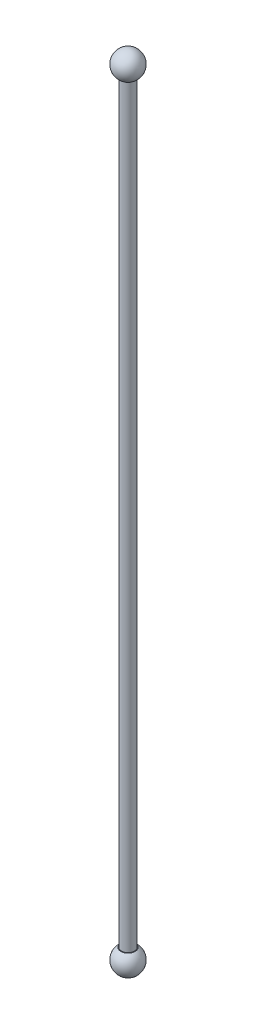
ISO-10303-21;
HEADER;
FILE_DESCRIPTION(('STEP AP214'),'2;1');
FILE_NAME('part.step','',(''),(''),'','','');
FILE_SCHEMA(('AUTOMOTIVE_DESIGN { 1 0 10303 214 1 1 1 1 }'));
ENDSEC;
DATA;
#1=APPLICATION_CONTEXT('core data for automotive mechanical design processes');
#2=APPLICATION_PROTOCOL_DEFINITION('international standard','automotive_design',2000,#1);
#3=PRODUCT_CONTEXT('',#1,'mechanical');
#4=PRODUCT('Part','Part','',(#3));
#5=PRODUCT_RELATED_PRODUCT_CATEGORY('part','',(#4));
#6=PRODUCT_DEFINITION_FORMATION('','',#4);
#7=PRODUCT_DEFINITION_CONTEXT('part definition',#1,'design');
#8=PRODUCT_DEFINITION('design','',#6,#7);
#9=PRODUCT_DEFINITION_SHAPE('','',#8);
#10=(LENGTH_UNIT() NAMED_UNIT(*) SI_UNIT(.MILLI.,.METRE.));
#11=(NAMED_UNIT(*) PLANE_ANGLE_UNIT() SI_UNIT($,.RADIAN.));
#12=(NAMED_UNIT(*) SI_UNIT($,.STERADIAN.) SOLID_ANGLE_UNIT());
#13=UNCERTAINTY_MEASURE_WITH_UNIT(LENGTH_MEASURE(1.E-05),#10,'distance_accuracy_value','');
#14=(GEOMETRIC_REPRESENTATION_CONTEXT(3) GLOBAL_UNCERTAINTY_ASSIGNED_CONTEXT((#13)) GLOBAL_UNIT_ASSIGNED_CONTEXT((#10,
#11,#12)) REPRESENTATION_CONTEXT('',''));
#15=CARTESIAN_POINT('',(0.,0.,0.));
#16=DIRECTION('',(0.,0.,1.));
#17=DIRECTION('',(1.,0.,0.));
#18=AXIS2_PLACEMENT_3D('',#15,#16,#17);
#19=CARTESIAN_POINT('',(0.,0.,0.));
#20=DIRECTION('',(0.,-1.,0.));
#21=DIRECTION('',(0.,0.,-1.));
#22=AXIS2_PLACEMENT_3D('',#19,#20,#21);
#23=CYLINDRICAL_SURFACE('',#22,3.00000000000003);
#24=CARTESIAN_POINT('',(0.,175.35,0.));
#25=DIRECTION('',(0.,-1.,0.));
#26=DIRECTION('',(0.,0.,-1.));
#27=AXIS2_PLACEMENT_3D('',#24,#25,#26);
#28=CIRCLE('',#27,3.00000000000003);
#29=CARTESIAN_POINT('',(0.,175.35,-3.00000000000003));
#30=VERTEX_POINT('',#29);
#31=EDGE_CURVE('E47',#30,#30,#28,.F.);
#32=ORIENTED_EDGE('',*,*,#31,.F.);
#33=EDGE_LOOP('',(#32));
#34=FACE_BOUND('',#33,.T.);
#35=CARTESIAN_POINT('',(0.,-175.35,0.));
#36=DIRECTION('',(0.,-1.,0.));
#37=DIRECTION('',(0.,0.,-1.));
#38=AXIS2_PLACEMENT_3D('',#35,#36,#37);
#39=CIRCLE('',#38,3.00000000000003);
#40=CARTESIAN_POINT('',(0.,-175.35,-3.00000000000003));
#41=VERTEX_POINT('',#40);
#42=EDGE_CURVE('E43',#41,#41,#39,.T.);
#43=ORIENTED_EDGE('',*,*,#42,.F.);
#44=EDGE_LOOP('',(#43));
#45=FACE_BOUND('',#44,.T.);
#46=ADVANCED_FACE('F35',(#34,#45),#23,.T.);
#47=CARTESIAN_POINT('',(0.,180.35,0.));
#48=DIRECTION('',(0.,-1.,0.));
#49=DIRECTION('',(1.,0.,0.));
#50=AXIS2_PLACEMENT_3D('',#47,#48,#49);
#51=SPHERICAL_SURFACE('',#50,6.);
#52=CARTESIAN_POINT('',(0.,175.35,0.));
#53=DIRECTION('',(0.,-1.,0.));
#54=DIRECTION('',(0.,0.,-1.));
#55=AXIS2_PLACEMENT_3D('',#52,#53,#54);
#56=CIRCLE('',#55,3.31662479035544);
#57=CARTESIAN_POINT('',(0.,175.35,-3.31662479035544));
#58=VERTEX_POINT('',#57);
#59=EDGE_CURVE('E51',#58,#58,#56,.T.);
#60=ORIENTED_EDGE('',*,*,#59,.F.);
#61=EDGE_LOOP('',(#60));
#62=FACE_BOUND('',#61,.T.);
#63=ADVANCED_FACE('F80',(#62),#51,.T.);
#64=CARTESIAN_POINT('',(0.,175.35,0.));
#65=DIRECTION('',(0.,-1.,0.));
#66=DIRECTION('',(0.,0.,-1.));
#67=AXIS2_PLACEMENT_3D('',#64,#65,#66);
#68=PLANE('',#67);
#69=ORIENTED_EDGE('',*,*,#31,.T.);
#70=EDGE_LOOP('',(#69));
#71=FACE_BOUND('',#70,.T.);
#72=ORIENTED_EDGE('',*,*,#59,.T.);
#73=EDGE_LOOP('',(#72));
#74=FACE_BOUND('',#73,.T.);
#75=ADVANCED_FACE('F73',(#71,#74),#68,.T.);
#76=CARTESIAN_POINT('',(0.,-180.35,0.));
#77=DIRECTION('',(0.,1.,0.));
#78=DIRECTION('',(1.,0.,0.));
#79=AXIS2_PLACEMENT_3D('',#76,#77,#78);
#80=SPHERICAL_SURFACE('',#79,6.);
#81=CARTESIAN_POINT('',(0.,-175.35,0.));
#82=DIRECTION('',(0.,-1.,0.));
#83=DIRECTION('',(0.,0.,-1.));
#84=AXIS2_PLACEMENT_3D('',#81,#82,#83);
#85=CIRCLE('',#84,3.31662479035544);
#86=CARTESIAN_POINT('',(0.,-175.35,-3.31662479035544));
#87=VERTEX_POINT('',#86);
#88=EDGE_CURVE('E59',#87,#87,#85,.T.);
#89=ORIENTED_EDGE('',*,*,#88,.T.);
#90=EDGE_LOOP('',(#89));
#91=FACE_BOUND('',#90,.T.);
#92=ADVANCED_FACE('F63',(#91),#80,.T.);
#93=CARTESIAN_POINT('',(0.,-175.35,0.));
#94=DIRECTION('',(0.,1.,0.));
#95=DIRECTION('',(0.,0.,-1.));
#96=AXIS2_PLACEMENT_3D('',#93,#94,#95);
#97=PLANE('',#96);
#98=ORIENTED_EDGE('',*,*,#42,.T.);
#99=EDGE_LOOP('',(#98));
#100=FACE_BOUND('',#99,.T.);
#101=ORIENTED_EDGE('',*,*,#88,.F.);
#102=EDGE_LOOP('',(#101));
#103=FACE_BOUND('',#102,.T.);
#104=ADVANCED_FACE('F65',(#100,#103),#97,.T.);
#105=CLOSED_SHELL('',(#46,#63,#75,#92,#104));
#106=CARTESIAN_POINT('',(0.,175.35,0.));
#107=DIRECTION('',(0.,-1.,0.));
#108=DIRECTION('',(0.,0.,-1.));
#109=AXIS2_PLACEMENT_3D('',#106,#107,#108);
#110=CIRCLE('',#109,2.00000000000003);
#111=CARTESIAN_POINT('',(0.,175.35,-2.00000000000003));
#112=VERTEX_POINT('',#111);
#113=EDGE_CURVE('E10',#112,#112,#110,.T.);
#114=ORIENTED_EDGE('',*,*,#113,.T.);
#115=EDGE_LOOP('',(#114));
#116=FACE_BOUND('',#115,.T.);
#117=ADVANCED_FACE('F91',(#116),#68,.T.);
#118=CARTESIAN_POINT('',(0.,0.,0.));
#119=DIRECTION('',(0.,-1.,0.));
#120=DIRECTION('',(0.,0.,-1.));
#121=AXIS2_PLACEMENT_3D('',#118,#119,#120);
#122=CYLINDRICAL_SURFACE('',#121,2.00000000000003);
#123=CARTESIAN_POINT('',(0.,-175.35,0.));
#124=DIRECTION('',(0.,1.,0.));
#125=DIRECTION('',(0.,0.,1.));
#126=AXIS2_PLACEMENT_3D('',#123,#124,#125);
#127=CIRCLE('',#126,2.00000000000003);
#128=CARTESIAN_POINT('',(0.,-175.35,2.00000000000003));
#129=VERTEX_POINT('',#128);
#130=EDGE_CURVE('E56',#129,#129,#127,.T.);
#131=ORIENTED_EDGE('',*,*,#130,.F.);
#132=EDGE_LOOP('',(#131));
#133=FACE_BOUND('',#132,.T.);
#134=ORIENTED_EDGE('',*,*,#113,.F.);
#135=EDGE_LOOP('',(#134));
#136=FACE_BOUND('',#135,.T.);
#137=ADVANCED_FACE('F37',(#133,#136),#122,.F.);
#138=ORIENTED_EDGE('',*,*,#130,.T.);
#139=EDGE_LOOP('',(#138));
#140=FACE_BOUND('',#139,.T.);
#141=ADVANCED_FACE('F68',(#140),#97,.T.);
#142=CLOSED_SHELL('',(#117,#137,#141));
#143=ORIENTED_CLOSED_SHELL('',*,#142,.T.);
#144=BREP_WITH_VOIDS('B2',#105,(#143));
#145=ADVANCED_BREP_SHAPE_REPRESENTATION('',(#18,#144),#14);
#146=SHAPE_DEFINITION_REPRESENTATION(#9,#145);
ENDSEC;
END-ISO-10303-21;
